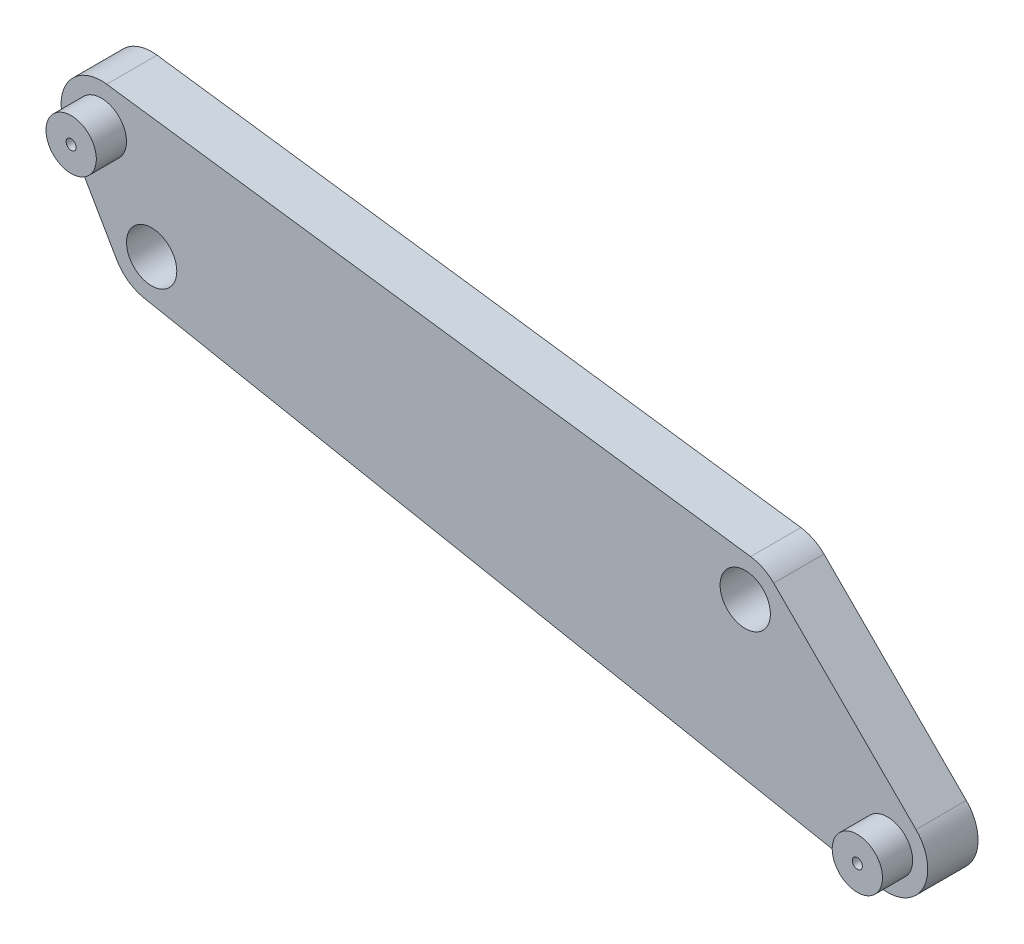
ISO-10303-21;
HEADER;
FILE_DESCRIPTION(('STEP AP214'),'2;1');
FILE_NAME('part.step','',(''),(''),'','','');
FILE_SCHEMA(('AUTOMOTIVE_DESIGN { 1 0 10303 214 1 1 1 1 }'));
ENDSEC;
DATA;
#1=APPLICATION_CONTEXT('core data for automotive mechanical design processes');
#2=APPLICATION_PROTOCOL_DEFINITION('international standard','automotive_design',2000,#1);
#3=PRODUCT_CONTEXT('',#1,'mechanical');
#4=PRODUCT('Part','Part','',(#3));
#5=PRODUCT_RELATED_PRODUCT_CATEGORY('part','',(#4));
#6=PRODUCT_DEFINITION_FORMATION('','',#4);
#7=PRODUCT_DEFINITION_CONTEXT('part definition',#1,'design');
#8=PRODUCT_DEFINITION('design','',#6,#7);
#9=PRODUCT_DEFINITION_SHAPE('','',#8);
#10=(LENGTH_UNIT() NAMED_UNIT(*) SI_UNIT(.MILLI.,.METRE.));
#11=(NAMED_UNIT(*) PLANE_ANGLE_UNIT() SI_UNIT($,.RADIAN.));
#12=(NAMED_UNIT(*) SI_UNIT($,.STERADIAN.) SOLID_ANGLE_UNIT());
#13=UNCERTAINTY_MEASURE_WITH_UNIT(LENGTH_MEASURE(1.E-05),#10,'distance_accuracy_value','');
#14=(GEOMETRIC_REPRESENTATION_CONTEXT(3) GLOBAL_UNCERTAINTY_ASSIGNED_CONTEXT((#13)) GLOBAL_UNIT_ASSIGNED_CONTEXT((#10,
#11,#12)) REPRESENTATION_CONTEXT('',''));
#15=CARTESIAN_POINT('',(0.,0.,0.));
#16=DIRECTION('',(0.,0.,1.));
#17=DIRECTION('',(1.,0.,0.));
#18=AXIS2_PLACEMENT_3D('',#15,#16,#17);
#19=CARTESIAN_POINT('',(-59.,0.,5.));
#20=DIRECTION('',(0.,0.,1.));
#21=DIRECTION('',(1.,0.,0.));
#22=AXIS2_PLACEMENT_3D('',#19,#20,#21);
#23=PLANE('',#22);
#24=CARTESIAN_POINT('',(0.,0.,5.));
#25=DIRECTION('',(0.,0.,1.));
#26=DIRECTION('',(1.,0.,0.));
#27=AXIS2_PLACEMENT_3D('',#24,#25,#26);
#28=CIRCLE('',#27,2.5);
#29=CARTESIAN_POINT('',(2.5,0.,5.));
#30=VERTEX_POINT('',#29);
#31=EDGE_CURVE('E220',#30,#30,#28,.T.);
#32=ORIENTED_EDGE('',*,*,#31,.F.);
#33=EDGE_LOOP('',(#32));
#34=FACE_BOUND('',#33,.T.);
#35=CARTESIAN_POINT('',(-59.,0.,5.));
#36=DIRECTION('',(0.,0.,1.));
#37=DIRECTION('',(1.,0.,0.));
#38=AXIS2_PLACEMENT_3D('',#35,#36,#37);
#39=CIRCLE('',#38,2.5);
#40=CARTESIAN_POINT('',(-56.5,0.,5.));
#41=VERTEX_POINT('',#40);
#42=EDGE_CURVE('E146',#41,#41,#39,.T.);
#43=ORIENTED_EDGE('',*,*,#42,.F.);
#44=EDGE_LOOP('',(#43));
#45=FACE_BOUND('',#44,.T.);
#46=CARTESIAN_POINT('',(-59.,0.,5.));
#47=DIRECTION('',(0.,0.,1.));
#48=DIRECTION('',(1.,0.,0.));
#49=AXIS2_PLACEMENT_3D('',#46,#47,#48);
#50=CIRCLE('',#49,4.00000000000001);
#51=CARTESIAN_POINT('',(-62.4641016151378,-2.00000000000001,5.));
#52=VERTEX_POINT('',#51);
#53=CARTESIAN_POINT('',(-59.7593419938109,-3.92726364488499,5.));
#54=VERTEX_POINT('',#53);
#55=EDGE_CURVE('E164',#52,#54,#50,.T.);
#56=ORIENTED_EDGE('',*,*,#55,.T.);
#57=DIRECTION('',(0.981815911221246,-0.189835498452724,0.));
#58=VECTOR('',#57,1.);
#59=CARTESIAN_POINT('',(13.3827936299201,-18.0693992686159,5.));
#60=LINE('',#59,#58);
#61=CARTESIAN_POINT('',(13.3827936299201,-18.0693992686159,5.));
#62=VERTEX_POINT('',#61);
#63=EDGE_CURVE('E100',#54,#62,#60,.T.);
#64=ORIENTED_EDGE('',*,*,#63,.T.);
#65=CARTESIAN_POINT('',(14.142135623731,-14.1421356237309,5.));
#66=DIRECTION('',(0.,0.,1.));
#67=DIRECTION('',(1.,0.,0.));
#68=AXIS2_PLACEMENT_3D('',#65,#66,#67);
#69=CIRCLE('',#68,4.);
#70=CARTESIAN_POINT('',(16.9705627484772,-11.3137084989847,5.));
#71=VERTEX_POINT('',#70);
#72=EDGE_CURVE('E185',#62,#71,#69,.T.);
#73=ORIENTED_EDGE('',*,*,#72,.T.);
#74=DIRECTION('',(-0.707106781186552,0.707106781186543,0.));
#75=VECTOR('',#74,1.);
#76=CARTESIAN_POINT('',(2.82842712474617,2.8284271247462,5.));
#77=LINE('',#76,#75);
#78=CARTESIAN_POINT('',(2.82842712474617,2.82842712474621,5.));
#79=VERTEX_POINT('',#78);
#80=EDGE_CURVE('E199',#71,#79,#77,.T.);
#81=ORIENTED_EDGE('',*,*,#80,.T.);
#82=CARTESIAN_POINT('',(0.,0.,5.));
#83=DIRECTION('',(0.,0.,1.));
#84=DIRECTION('',(1.,0.,0.));
#85=AXIS2_PLACEMENT_3D('',#82,#83,#84);
#86=CIRCLE('',#85,4.);
#87=CARTESIAN_POINT('',(0.536377470795685,3.96387426753458,5.));
#88=VERTEX_POINT('',#87);
#89=EDGE_CURVE('E119',#79,#88,#86,.T.);
#90=ORIENTED_EDGE('',*,*,#89,.T.);
#91=DIRECTION('',(-0.990968566883646,0.134094367698921,0.));
#92=VECTOR('',#91,1.);
#93=CARTESIAN_POINT('',(-63.4636225292043,12.624128305379,5.));
#94=LINE('',#93,#92);
#95=CARTESIAN_POINT('',(-63.4636225292043,12.624128305379,5.));
#96=VERTEX_POINT('',#95);
#97=EDGE_CURVE('E113',#88,#96,#94,.T.);
#98=ORIENTED_EDGE('',*,*,#97,.T.);
#99=CARTESIAN_POINT('',(-64.,8.66025403784439,5.));
#100=DIRECTION('',(0.,0.,1.));
#101=DIRECTION('',(1.,0.,0.));
#102=AXIS2_PLACEMENT_3D('',#99,#100,#101);
#103=CIRCLE('',#102,4.00000000000001);
#104=CARTESIAN_POINT('',(-67.4641016151378,6.66025403784439,5.));
#105=VERTEX_POINT('',#104);
#106=EDGE_CURVE('E117',#96,#105,#103,.T.);
#107=ORIENTED_EDGE('',*,*,#106,.T.);
#108=DIRECTION('',(0.499999999999999,-0.86602540378444,0.));
#109=VECTOR('',#108,1.);
#110=CARTESIAN_POINT('',(-62.4641016151378,-2.00000000000001,5.));
#111=LINE('',#110,#109);
#112=EDGE_CURVE('E57',#105,#52,#111,.T.);
#113=ORIENTED_EDGE('',*,*,#112,.T.);
#114=EDGE_LOOP('',(#56,#64,#73,#81,#90,#98,#107,#113));
#115=FACE_BOUND('',#114,.T.);
#116=CARTESIAN_POINT('',(-64.,8.66025403784439,5.));
#117=DIRECTION('',(0.,0.,1.));
#118=DIRECTION('',(1.,0.,0.));
#119=AXIS2_PLACEMENT_3D('',#116,#117,#118);
#120=CIRCLE('',#119,2.50000000000001);
#121=CARTESIAN_POINT('',(-61.5,8.66025403784439,5.));
#122=VERTEX_POINT('',#121);
#123=EDGE_CURVE('E213',#122,#122,#120,.T.);
#124=ORIENTED_EDGE('',*,*,#123,.F.);
#125=EDGE_LOOP('',(#124));
#126=FACE_BOUND('',#125,.T.);
#127=CARTESIAN_POINT('',(14.142135623731,-14.1421356237309,5.));
#128=DIRECTION('',(0.,0.,1.));
#129=DIRECTION('',(1.,0.,0.));
#130=AXIS2_PLACEMENT_3D('',#127,#128,#129);
#131=CIRCLE('',#130,2.5);
#132=CARTESIAN_POINT('',(16.642135623731,-14.1421356237309,5.));
#133=VERTEX_POINT('',#132);
#134=EDGE_CURVE('E225',#133,#133,#131,.T.);
#135=ORIENTED_EDGE('',*,*,#134,.F.);
#136=EDGE_LOOP('',(#135));
#137=FACE_BOUND('',#136,.T.);
#138=ADVANCED_FACE('F39',(#34,#45,#115,#126,#137),#23,.T.);
#139=CARTESIAN_POINT('',(-59.,0.,0.));
#140=DIRECTION('',(0.,0.,1.));
#141=DIRECTION('',(1.,0.,0.));
#142=AXIS2_PLACEMENT_3D('',#139,#140,#141);
#143=PLANE('',#142);
#144=CARTESIAN_POINT('',(-59.,0.,0.));
#145=DIRECTION('',(0.,0.,1.));
#146=DIRECTION('',(1.,0.,0.));
#147=AXIS2_PLACEMENT_3D('',#144,#145,#146);
#148=CIRCLE('',#147,4.00000000000001);
#149=CARTESIAN_POINT('',(-62.4641016151378,-2.00000000000001,0.));
#150=VERTEX_POINT('',#149);
#151=CARTESIAN_POINT('',(-59.7593419938109,-3.92726364488499,0.));
#152=VERTEX_POINT('',#151);
#153=EDGE_CURVE('E141',#150,#152,#148,.T.);
#154=ORIENTED_EDGE('',*,*,#153,.F.);
#155=DIRECTION('',(0.499999999999999,-0.86602540378444,0.));
#156=VECTOR('',#155,1.);
#157=CARTESIAN_POINT('',(-62.4641016151378,-2.00000000000001,0.));
#158=LINE('',#157,#156);
#159=CARTESIAN_POINT('',(-67.4641016151378,6.66025403784439,0.));
#160=VERTEX_POINT('',#159);
#161=EDGE_CURVE('E92',#160,#150,#158,.T.);
#162=ORIENTED_EDGE('',*,*,#161,.F.);
#163=CARTESIAN_POINT('',(-64.,8.66025403784439,0.));
#164=DIRECTION('',(0.,0.,1.));
#165=DIRECTION('',(1.,0.,0.));
#166=AXIS2_PLACEMENT_3D('',#163,#164,#165);
#167=CIRCLE('',#166,4.00000000000001);
#168=CARTESIAN_POINT('',(-63.4636225292043,12.624128305379,0.));
#169=VERTEX_POINT('',#168);
#170=EDGE_CURVE('E86',#169,#160,#167,.T.);
#171=ORIENTED_EDGE('',*,*,#170,.F.);
#172=DIRECTION('',(-0.990968566883646,0.134094367698921,0.));
#173=VECTOR('',#172,1.);
#174=CARTESIAN_POINT('',(-63.4636225292043,12.624128305379,0.));
#175=LINE('',#174,#173);
#176=CARTESIAN_POINT('',(0.536377470795685,3.96387426753458,0.));
#177=VERTEX_POINT('',#176);
#178=EDGE_CURVE('E128',#177,#169,#175,.T.);
#179=ORIENTED_EDGE('',*,*,#178,.F.);
#180=CARTESIAN_POINT('',(0.,0.,0.));
#181=DIRECTION('',(0.,0.,1.));
#182=DIRECTION('',(1.,0.,0.));
#183=AXIS2_PLACEMENT_3D('',#180,#181,#182);
#184=CIRCLE('',#183,4.);
#185=CARTESIAN_POINT('',(2.82842712474617,2.82842712474621,0.));
#186=VERTEX_POINT('',#185);
#187=EDGE_CURVE('E155',#186,#177,#184,.T.);
#188=ORIENTED_EDGE('',*,*,#187,.F.);
#189=DIRECTION('',(-0.707106781186552,0.707106781186543,0.));
#190=VECTOR('',#189,1.);
#191=CARTESIAN_POINT('',(2.82842712474617,2.8284271247462,0.));
#192=LINE('',#191,#190);
#193=CARTESIAN_POINT('',(16.9705627484772,-11.3137084989847,0.));
#194=VERTEX_POINT('',#193);
#195=EDGE_CURVE('E152',#194,#186,#192,.T.);
#196=ORIENTED_EDGE('',*,*,#195,.F.);
#197=CARTESIAN_POINT('',(14.142135623731,-14.1421356237309,0.));
#198=DIRECTION('',(0.,0.,1.));
#199=DIRECTION('',(1.,0.,0.));
#200=AXIS2_PLACEMENT_3D('',#197,#198,#199);
#201=CIRCLE('',#200,4.);
#202=CARTESIAN_POINT('',(13.3827936299201,-18.0693992686159,0.));
#203=VERTEX_POINT('',#202);
#204=EDGE_CURVE('E149',#203,#194,#201,.T.);
#205=ORIENTED_EDGE('',*,*,#204,.F.);
#206=DIRECTION('',(0.981815911221246,-0.189835498452724,0.));
#207=VECTOR('',#206,1.);
#208=CARTESIAN_POINT('',(13.3827936299201,-18.0693992686159,0.));
#209=LINE('',#208,#207);
#210=EDGE_CURVE('E145',#152,#203,#209,.T.);
#211=ORIENTED_EDGE('',*,*,#210,.F.);
#212=EDGE_LOOP('',(#154,#162,#171,#179,#188,#196,#205,#211));
#213=FACE_BOUND('',#212,.T.);
#214=CARTESIAN_POINT('',(-59.,0.,0.));
#215=DIRECTION('',(0.,0.,1.));
#216=DIRECTION('',(1.,0.,0.));
#217=AXIS2_PLACEMENT_3D('',#214,#215,#216);
#218=CIRCLE('',#217,2.5);
#219=CARTESIAN_POINT('',(-56.5,0.,0.));
#220=VERTEX_POINT('',#219);
#221=EDGE_CURVE('E209',#220,#220,#218,.T.);
#222=ORIENTED_EDGE('',*,*,#221,.T.);
#223=EDGE_LOOP('',(#222));
#224=FACE_BOUND('',#223,.T.);
#225=CARTESIAN_POINT('',(0.,0.,0.));
#226=DIRECTION('',(0.,0.,1.));
#227=DIRECTION('',(1.,0.,0.));
#228=AXIS2_PLACEMENT_3D('',#225,#226,#227);
#229=CIRCLE('',#228,2.5);
#230=CARTESIAN_POINT('',(2.5,0.,0.));
#231=VERTEX_POINT('',#230);
#232=EDGE_CURVE('E221',#231,#231,#229,.T.);
#233=ORIENTED_EDGE('',*,*,#232,.T.);
#234=EDGE_LOOP('',(#233));
#235=FACE_BOUND('',#234,.T.);
#236=CARTESIAN_POINT('',(-64.,8.66025403784439,0.));
#237=DIRECTION('',(0.,0.,-1.));
#238=DIRECTION('',(-1.,0.,0.));
#239=AXIS2_PLACEMENT_3D('',#236,#237,#238);
#240=CIRCLE('',#239,0.499999999999999);
#241=CARTESIAN_POINT('',(-64.5,8.66025403784439,0.));
#242=VERTEX_POINT('',#241);
#243=EDGE_CURVE('E237',#242,#242,#240,.T.);
#244=ORIENTED_EDGE('',*,*,#243,.F.);
#245=EDGE_LOOP('',(#244));
#246=FACE_BOUND('',#245,.T.);
#247=CARTESIAN_POINT('',(14.142135623731,-14.1421356237309,0.));
#248=DIRECTION('',(0.,0.,-1.));
#249=DIRECTION('',(-1.,0.,0.));
#250=AXIS2_PLACEMENT_3D('',#247,#248,#249);
#251=CIRCLE('',#250,0.500000000000001);
#252=CARTESIAN_POINT('',(13.642135623731,-14.1421356237309,0.));
#253=VERTEX_POINT('',#252);
#254=EDGE_CURVE('E249',#253,#253,#251,.T.);
#255=ORIENTED_EDGE('',*,*,#254,.F.);
#256=EDGE_LOOP('',(#255));
#257=FACE_BOUND('',#256,.T.);
#258=ADVANCED_FACE('F189',(#213,#224,#235,#246,#257),#143,.F.);
#259=CARTESIAN_POINT('',(-59.,0.,5.));
#260=DIRECTION('',(0.,0.,-1.));
#261=DIRECTION('',(-1.,0.,0.));
#262=AXIS2_PLACEMENT_3D('',#259,#260,#261);
#263=CYLINDRICAL_SURFACE('',#262,4.00000000000001);
#264=ORIENTED_EDGE('',*,*,#153,.T.);
#265=DIRECTION('',(0.,0.,-1.));
#266=VECTOR('',#265,1.);
#267=CARTESIAN_POINT('',(-59.7593419938109,-3.92726364488499,5.));
#268=LINE('',#267,#266);
#269=EDGE_CURVE('E11',#54,#152,#268,.T.);
#270=ORIENTED_EDGE('',*,*,#269,.F.);
#271=ORIENTED_EDGE('',*,*,#55,.F.);
#272=DIRECTION('',(0.,0.,-1.));
#273=VECTOR('',#272,1.);
#274=CARTESIAN_POINT('',(-62.4641016151378,-2.00000000000001,5.));
#275=LINE('',#274,#273);
#276=EDGE_CURVE('E137',#52,#150,#275,.T.);
#277=ORIENTED_EDGE('',*,*,#276,.T.);
#278=EDGE_LOOP('',(#264,#270,#271,#277));
#279=FACE_BOUND('',#278,.T.);
#280=ADVANCED_FACE('F41',(#279),#263,.T.);
#281=CARTESIAN_POINT('',(13.3827936299201,-18.0693992686159,5.));
#282=DIRECTION('',(0.189835498452724,0.981815911221246,0.));
#283=DIRECTION('',(-0.981815911221246,0.189835498452724,0.));
#284=AXIS2_PLACEMENT_3D('',#281,#282,#283);
#285=PLANE('',#284);
#286=ORIENTED_EDGE('',*,*,#210,.T.);
#287=DIRECTION('',(0.,0.,-1.));
#288=VECTOR('',#287,1.);
#289=CARTESIAN_POINT('',(13.3827936299201,-18.0693992686159,5.));
#290=LINE('',#289,#288);
#291=EDGE_CURVE('E49',#62,#203,#290,.T.);
#292=ORIENTED_EDGE('',*,*,#291,.F.);
#293=ORIENTED_EDGE('',*,*,#63,.F.);
#294=ORIENTED_EDGE('',*,*,#269,.T.);
#295=EDGE_LOOP('',(#286,#292,#293,#294));
#296=FACE_BOUND('',#295,.T.);
#297=ADVANCED_FACE('F272',(#296),#285,.F.);
#298=CARTESIAN_POINT('',(14.142135623731,-14.1421356237309,5.));
#299=DIRECTION('',(0.,0.,-1.));
#300=DIRECTION('',(-1.,0.,0.));
#301=AXIS2_PLACEMENT_3D('',#298,#299,#300);
#302=CYLINDRICAL_SURFACE('',#301,4.);
#303=ORIENTED_EDGE('',*,*,#204,.T.);
#304=DIRECTION('',(0.,0.,-1.));
#305=VECTOR('',#304,1.);
#306=CARTESIAN_POINT('',(16.9705627484772,-11.3137084989847,5.));
#307=LINE('',#306,#305);
#308=EDGE_CURVE('E175',#71,#194,#307,.T.);
#309=ORIENTED_EDGE('',*,*,#308,.F.);
#310=ORIENTED_EDGE('',*,*,#72,.F.);
#311=ORIENTED_EDGE('',*,*,#291,.T.);
#312=EDGE_LOOP('',(#303,#309,#310,#311));
#313=FACE_BOUND('',#312,.T.);
#314=ADVANCED_FACE('F183',(#313),#302,.T.);
#315=CARTESIAN_POINT('',(2.82842712474617,2.8284271247462,5.));
#316=DIRECTION('',(-0.707106781186543,-0.707106781186552,0.));
#317=DIRECTION('',(0.707106781186552,-0.707106781186543,0.));
#318=AXIS2_PLACEMENT_3D('',#315,#316,#317);
#319=PLANE('',#318);
#320=ORIENTED_EDGE('',*,*,#195,.T.);
#321=DIRECTION('',(0.,0.,-1.));
#322=VECTOR('',#321,1.);
#323=CARTESIAN_POINT('',(2.82842712474617,2.82842712474621,5.));
#324=LINE('',#323,#322);
#325=EDGE_CURVE('E171',#79,#186,#324,.T.);
#326=ORIENTED_EDGE('',*,*,#325,.F.);
#327=ORIENTED_EDGE('',*,*,#80,.F.);
#328=ORIENTED_EDGE('',*,*,#308,.T.);
#329=EDGE_LOOP('',(#320,#326,#327,#328));
#330=FACE_BOUND('',#329,.T.);
#331=ADVANCED_FACE('F194',(#330),#319,.F.);
#332=CARTESIAN_POINT('',(0.,0.,5.));
#333=DIRECTION('',(0.,0.,-1.));
#334=DIRECTION('',(-1.,0.,0.));
#335=AXIS2_PLACEMENT_3D('',#332,#333,#334);
#336=CYLINDRICAL_SURFACE('',#335,4.);
#337=ORIENTED_EDGE('',*,*,#187,.T.);
#338=DIRECTION('',(0.,0.,-1.));
#339=VECTOR('',#338,1.);
#340=CARTESIAN_POINT('',(0.536377470795685,3.96387426753458,5.));
#341=LINE('',#340,#339);
#342=EDGE_CURVE('E130',#88,#177,#341,.T.);
#343=ORIENTED_EDGE('',*,*,#342,.F.);
#344=ORIENTED_EDGE('',*,*,#89,.F.);
#345=ORIENTED_EDGE('',*,*,#325,.T.);
#346=EDGE_LOOP('',(#337,#343,#344,#345));
#347=FACE_BOUND('',#346,.T.);
#348=ADVANCED_FACE('F197',(#347),#336,.T.);
#349=CARTESIAN_POINT('',(-63.4636225292043,12.624128305379,5.));
#350=DIRECTION('',(-0.134094367698921,-0.990968566883646,0.));
#351=DIRECTION('',(0.990968566883646,-0.134094367698921,0.));
#352=AXIS2_PLACEMENT_3D('',#349,#350,#351);
#353=PLANE('',#352);
#354=ORIENTED_EDGE('',*,*,#178,.T.);
#355=DIRECTION('',(0.,0.,-1.));
#356=VECTOR('',#355,1.);
#357=CARTESIAN_POINT('',(-63.4636225292043,12.624128305379,5.));
#358=LINE('',#357,#356);
#359=EDGE_CURVE('E125',#96,#169,#358,.T.);
#360=ORIENTED_EDGE('',*,*,#359,.F.);
#361=ORIENTED_EDGE('',*,*,#97,.F.);
#362=ORIENTED_EDGE('',*,*,#342,.T.);
#363=EDGE_LOOP('',(#354,#360,#361,#362));
#364=FACE_BOUND('',#363,.T.);
#365=ADVANCED_FACE('F126',(#364),#353,.F.);
#366=CARTESIAN_POINT('',(-64.,8.66025403784439,5.));
#367=DIRECTION('',(0.,0.,-1.));
#368=DIRECTION('',(-1.,0.,0.));
#369=AXIS2_PLACEMENT_3D('',#366,#367,#368);
#370=CYLINDRICAL_SURFACE('',#369,4.00000000000001);
#371=ORIENTED_EDGE('',*,*,#170,.T.);
#372=DIRECTION('',(0.,0.,-1.));
#373=VECTOR('',#372,1.);
#374=CARTESIAN_POINT('',(-67.4641016151378,6.66025403784439,5.));
#375=LINE('',#374,#373);
#376=EDGE_CURVE('E131',#105,#160,#375,.T.);
#377=ORIENTED_EDGE('',*,*,#376,.F.);
#378=ORIENTED_EDGE('',*,*,#106,.F.);
#379=ORIENTED_EDGE('',*,*,#359,.T.);
#380=EDGE_LOOP('',(#371,#377,#378,#379));
#381=FACE_BOUND('',#380,.T.);
#382=ADVANCED_FACE('F133',(#381),#370,.T.);
#383=CARTESIAN_POINT('',(-62.4641016151378,-2.00000000000001,5.));
#384=DIRECTION('',(0.86602540378444,0.499999999999998,0.));
#385=DIRECTION('',(-0.499999999999998,0.86602540378444,0.));
#386=AXIS2_PLACEMENT_3D('',#383,#384,#385);
#387=PLANE('',#386);
#388=ORIENTED_EDGE('',*,*,#161,.T.);
#389=ORIENTED_EDGE('',*,*,#276,.F.);
#390=ORIENTED_EDGE('',*,*,#112,.F.);
#391=ORIENTED_EDGE('',*,*,#376,.T.);
#392=EDGE_LOOP('',(#388,#389,#390,#391));
#393=FACE_BOUND('',#392,.T.);
#394=ADVANCED_FACE('F278',(#393),#387,.F.);
#395=CARTESIAN_POINT('',(-59.,0.,5.));
#396=DIRECTION('',(0.,0.,-1.));
#397=DIRECTION('',(-1.,0.,0.));
#398=AXIS2_PLACEMENT_3D('',#395,#396,#397);
#399=CYLINDRICAL_SURFACE('',#398,2.5);
#400=ORIENTED_EDGE('',*,*,#42,.T.);
#401=EDGE_LOOP('',(#400));
#402=FACE_BOUND('',#401,.T.);
#403=ORIENTED_EDGE('',*,*,#221,.F.);
#404=EDGE_LOOP('',(#403));
#405=FACE_BOUND('',#404,.T.);
#406=ADVANCED_FACE('F281',(#402,#405),#399,.F.);
#407=CARTESIAN_POINT('',(0.,0.,5.));
#408=DIRECTION('',(0.,0.,-1.));
#409=DIRECTION('',(-1.,0.,0.));
#410=AXIS2_PLACEMENT_3D('',#407,#408,#409);
#411=CYLINDRICAL_SURFACE('',#410,2.5);
#412=ORIENTED_EDGE('',*,*,#31,.T.);
#413=EDGE_LOOP('',(#412));
#414=FACE_BOUND('',#413,.T.);
#415=ORIENTED_EDGE('',*,*,#232,.F.);
#416=EDGE_LOOP('',(#415));
#417=FACE_BOUND('',#416,.T.);
#418=ADVANCED_FACE('F328',(#414,#417),#411,.F.);
#419=CARTESIAN_POINT('',(-64.,8.66025403784439,8.));
#420=DIRECTION('',(0.,0.,-1.));
#421=DIRECTION('',(-1.,0.,0.));
#422=AXIS2_PLACEMENT_3D('',#419,#420,#421);
#423=CYLINDRICAL_SURFACE('',#422,2.50000000000001);
#424=ORIENTED_EDGE('',*,*,#123,.T.);
#425=EDGE_LOOP('',(#424));
#426=FACE_BOUND('',#425,.T.);
#427=CARTESIAN_POINT('',(-64.,8.66025403784439,8.));
#428=DIRECTION('',(0.,0.,-1.));
#429=DIRECTION('',(-1.,0.,0.));
#430=AXIS2_PLACEMENT_3D('',#427,#428,#429);
#431=CIRCLE('',#430,2.50000000000001);
#432=CARTESIAN_POINT('',(-66.5,8.66025403784439,8.));
#433=VERTEX_POINT('',#432);
#434=EDGE_CURVE('E232',#433,#433,#431,.T.);
#435=ORIENTED_EDGE('',*,*,#434,.T.);
#436=EDGE_LOOP('',(#435));
#437=FACE_BOUND('',#436,.T.);
#438=ADVANCED_FACE('F335',(#426,#437),#423,.T.);
#439=CARTESIAN_POINT('',(-64.,8.66025403784439,8.));
#440=DIRECTION('',(0.,0.,-1.));
#441=DIRECTION('',(-1.,0.,0.));
#442=AXIS2_PLACEMENT_3D('',#439,#440,#441);
#443=PLANE('',#442);
#444=CARTESIAN_POINT('',(-64.,8.66025403784439,8.));
#445=DIRECTION('',(0.,0.,-1.));
#446=DIRECTION('',(-1.,0.,0.));
#447=AXIS2_PLACEMENT_3D('',#444,#445,#446);
#448=CIRCLE('',#447,0.499999999999999);
#449=CARTESIAN_POINT('',(-64.5,8.66025403784439,8.));
#450=VERTEX_POINT('',#449);
#451=EDGE_CURVE('E236',#450,#450,#448,.T.);
#452=ORIENTED_EDGE('',*,*,#451,.T.);
#453=EDGE_LOOP('',(#452));
#454=FACE_BOUND('',#453,.T.);
#455=ORIENTED_EDGE('',*,*,#434,.F.);
#456=EDGE_LOOP('',(#455));
#457=FACE_BOUND('',#456,.T.);
#458=ADVANCED_FACE('F343',(#454,#457),#443,.F.);
#459=CARTESIAN_POINT('',(-64.,8.66025403784439,8.));
#460=DIRECTION('',(0.,0.,-1.));
#461=DIRECTION('',(-1.,0.,0.));
#462=AXIS2_PLACEMENT_3D('',#459,#460,#461);
#463=CYLINDRICAL_SURFACE('',#462,0.499999999999999);
#464=ORIENTED_EDGE('',*,*,#451,.F.);
#465=EDGE_LOOP('',(#464));
#466=FACE_BOUND('',#465,.T.);
#467=ORIENTED_EDGE('',*,*,#243,.T.);
#468=EDGE_LOOP('',(#467));
#469=FACE_BOUND('',#468,.T.);
#470=ADVANCED_FACE('F351',(#466,#469),#463,.F.);
#471=CARTESIAN_POINT('',(14.142135623731,-14.1421356237309,8.));
#472=DIRECTION('',(0.,0.,-1.));
#473=DIRECTION('',(-1.,0.,0.));
#474=AXIS2_PLACEMENT_3D('',#471,#472,#473);
#475=CYLINDRICAL_SURFACE('',#474,2.5);
#476=ORIENTED_EDGE('',*,*,#134,.T.);
#477=EDGE_LOOP('',(#476));
#478=FACE_BOUND('',#477,.T.);
#479=CARTESIAN_POINT('',(14.142135623731,-14.1421356237309,8.));
#480=DIRECTION('',(0.,0.,-1.));
#481=DIRECTION('',(-1.,0.,0.));
#482=AXIS2_PLACEMENT_3D('',#479,#480,#481);
#483=CIRCLE('',#482,2.5);
#484=CARTESIAN_POINT('',(11.642135623731,-14.1421356237309,8.));
#485=VERTEX_POINT('',#484);
#486=EDGE_CURVE('E241',#485,#485,#483,.T.);
#487=ORIENTED_EDGE('',*,*,#486,.T.);
#488=EDGE_LOOP('',(#487));
#489=FACE_BOUND('',#488,.T.);
#490=ADVANCED_FACE('F359',(#478,#489),#475,.T.);
#491=CARTESIAN_POINT('',(14.142135623731,-14.1421356237309,8.));
#492=DIRECTION('',(0.,0.,-1.));
#493=DIRECTION('',(-1.,0.,0.));
#494=AXIS2_PLACEMENT_3D('',#491,#492,#493);
#495=PLANE('',#494);
#496=CARTESIAN_POINT('',(14.142135623731,-14.1421356237309,8.));
#497=DIRECTION('',(0.,0.,-1.));
#498=DIRECTION('',(-1.,0.,0.));
#499=AXIS2_PLACEMENT_3D('',#496,#497,#498);
#500=CIRCLE('',#499,0.500000000000001);
#501=CARTESIAN_POINT('',(13.642135623731,-14.1421356237309,8.));
#502=VERTEX_POINT('',#501);
#503=EDGE_CURVE('E248',#502,#502,#500,.T.);
#504=ORIENTED_EDGE('',*,*,#503,.T.);
#505=EDGE_LOOP('',(#504));
#506=FACE_BOUND('',#505,.T.);
#507=ORIENTED_EDGE('',*,*,#486,.F.);
#508=EDGE_LOOP('',(#507));
#509=FACE_BOUND('',#508,.T.);
#510=ADVANCED_FACE('F257',(#506,#509),#495,.F.);
#511=CARTESIAN_POINT('',(14.142135623731,-14.1421356237309,8.));
#512=DIRECTION('',(0.,0.,-1.));
#513=DIRECTION('',(-1.,0.,0.));
#514=AXIS2_PLACEMENT_3D('',#511,#512,#513);
#515=CYLINDRICAL_SURFACE('',#514,0.500000000000001);
#516=ORIENTED_EDGE('',*,*,#503,.F.);
#517=EDGE_LOOP('',(#516));
#518=FACE_BOUND('',#517,.T.);
#519=ORIENTED_EDGE('',*,*,#254,.T.);
#520=EDGE_LOOP('',(#519));
#521=FACE_BOUND('',#520,.T.);
#522=ADVANCED_FACE('F260',(#518,#521),#515,.F.);
#523=CLOSED_SHELL('',(#138,#258,#280,#297,#314,#331,#348,#365,#382,#394,#406,#418,#438,#458,
#470,#490,#510,#522));
#524=MANIFOLD_SOLID_BREP('B2',#523);
#525=ADVANCED_BREP_SHAPE_REPRESENTATION('',(#18,#524),#14);
#526=SHAPE_DEFINITION_REPRESENTATION(#9,#525);
ENDSEC;
END-ISO-10303-21;
